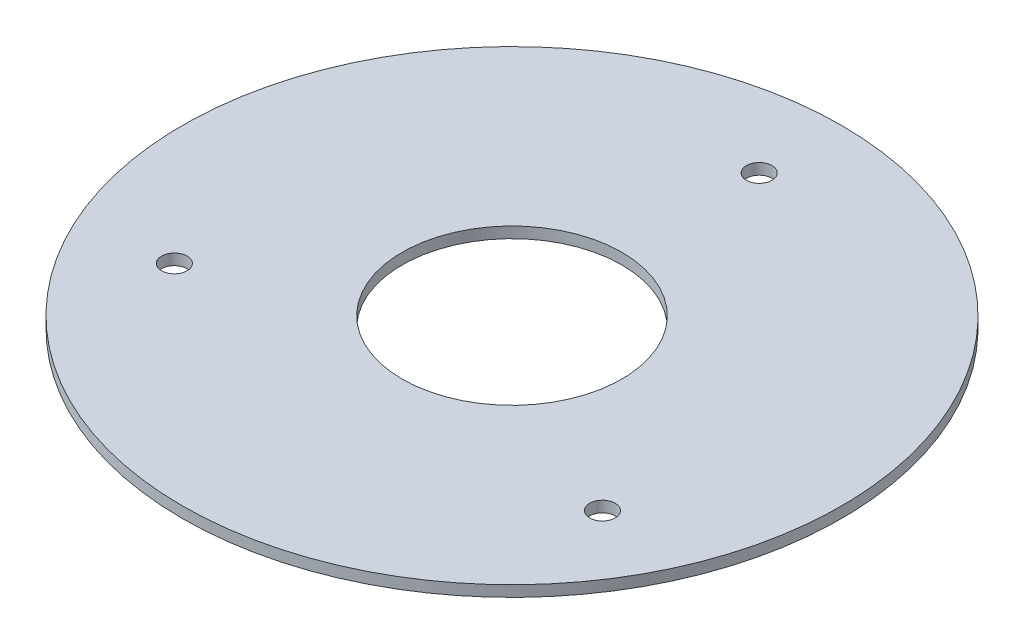
ISO-10303-21;
HEADER;
FILE_DESCRIPTION(('STEP AP214'),'2;1');
FILE_NAME('part.step','',(''),(''),'','','');
FILE_SCHEMA(('AUTOMOTIVE_DESIGN { 1 0 10303 214 1 1 1 1 }'));
ENDSEC;
DATA;
#1=APPLICATION_CONTEXT('core data for automotive mechanical design processes');
#2=APPLICATION_PROTOCOL_DEFINITION('international standard','automotive_design',2000,#1);
#3=PRODUCT_CONTEXT('',#1,'mechanical');
#4=PRODUCT('Part','Part','',(#3));
#5=PRODUCT_RELATED_PRODUCT_CATEGORY('part','',(#4));
#6=PRODUCT_DEFINITION_FORMATION('','',#4);
#7=PRODUCT_DEFINITION_CONTEXT('part definition',#1,'design');
#8=PRODUCT_DEFINITION('design','',#6,#7);
#9=PRODUCT_DEFINITION_SHAPE('','',#8);
#10=(LENGTH_UNIT() NAMED_UNIT(*) SI_UNIT(.MILLI.,.METRE.));
#11=(NAMED_UNIT(*) PLANE_ANGLE_UNIT() SI_UNIT($,.RADIAN.));
#12=(NAMED_UNIT(*) SI_UNIT($,.STERADIAN.) SOLID_ANGLE_UNIT());
#13=UNCERTAINTY_MEASURE_WITH_UNIT(LENGTH_MEASURE(1.E-05),#10,'distance_accuracy_value','');
#14=(GEOMETRIC_REPRESENTATION_CONTEXT(3) GLOBAL_UNCERTAINTY_ASSIGNED_CONTEXT((#13)) GLOBAL_UNIT_ASSIGNED_CONTEXT((#10,
#11,#12)) REPRESENTATION_CONTEXT('',''));
#15=CARTESIAN_POINT('',(0.,0.,0.));
#16=DIRECTION('',(0.,0.,1.));
#17=DIRECTION('',(1.,0.,0.));
#18=AXIS2_PLACEMENT_3D('',#15,#16,#17);
#19=CARTESIAN_POINT('',(0.,2.,0.));
#20=DIRECTION('',(0.,1.,0.));
#21=DIRECTION('',(0.,0.,1.));
#22=AXIS2_PLACEMENT_3D('',#19,#20,#21);
#23=PLANE('',#22);
#24=CARTESIAN_POINT('',(38.9741308020582,2.,22.50172491));
#25=DIRECTION('',(0.,1.,0.));
#26=DIRECTION('',(0.,0.,1.));
#27=AXIS2_PLACEMENT_3D('',#24,#25,#26);
#28=CIRCLE('',#27,2.32306613023066);
#29=CARTESIAN_POINT('',(38.9741308020582,2.,24.8247910402306));
#30=VERTEX_POINT('',#29);
#31=EDGE_CURVE('E54',#30,#30,#28,.T.);
#32=ORIENTED_EDGE('',*,*,#31,.F.);
#33=EDGE_LOOP('',(#32));
#34=FACE_BOUND('',#33,.T.);
#35=CARTESIAN_POINT('',(0.,2.,0.));
#36=DIRECTION('',(0.,1.,0.));
#37=DIRECTION('',(0.,0.,1.));
#38=AXIS2_PLACEMENT_3D('',#35,#36,#37);
#39=CIRCLE('',#38,20.);
#40=CARTESIAN_POINT('',(0.,2.,20.));
#41=VERTEX_POINT('',#40);
#42=EDGE_CURVE('E43',#41,#41,#39,.T.);
#43=ORIENTED_EDGE('',*,*,#42,.F.);
#44=EDGE_LOOP('',(#43));
#45=FACE_BOUND('',#44,.T.);
#46=CARTESIAN_POINT('',(0.,2.,0.));
#47=DIRECTION('',(0.,1.,0.));
#48=DIRECTION('',(0.,0.,1.));
#49=AXIS2_PLACEMENT_3D('',#46,#47,#48);
#50=CIRCLE('',#49,60.);
#51=CARTESIAN_POINT('',(0.,2.,60.));
#52=VERTEX_POINT('',#51);
#53=EDGE_CURVE('E10',#52,#52,#50,.T.);
#54=ORIENTED_EDGE('',*,*,#53,.T.);
#55=EDGE_LOOP('',(#54));
#56=FACE_BOUND('',#55,.T.);
#57=CARTESIAN_POINT('',(0.,2.,-45.00344982));
#58=DIRECTION('',(0.,1.,0.));
#59=DIRECTION('',(0.,0.,1.));
#60=AXIS2_PLACEMENT_3D('',#57,#58,#59);
#61=CIRCLE('',#60,2.32306613023085);
#62=CARTESIAN_POINT('',(0.,2.,-42.6803836897691));
#63=VERTEX_POINT('',#62);
#64=EDGE_CURVE('E48',#63,#63,#61,.T.);
#65=ORIENTED_EDGE('',*,*,#64,.F.);
#66=EDGE_LOOP('',(#65));
#67=FACE_BOUND('',#66,.T.);
#68=CARTESIAN_POINT('',(-38.9741308020582,2.,22.50172491));
#69=DIRECTION('',(0.,1.,0.));
#70=DIRECTION('',(0.,0.,1.));
#71=AXIS2_PLACEMENT_3D('',#68,#69,#70);
#72=CIRCLE('',#71,2.32306613023086);
#73=CARTESIAN_POINT('',(-38.9741308020582,2.,24.8247910402309));
#74=VERTEX_POINT('',#73);
#75=EDGE_CURVE('E60',#74,#74,#72,.T.);
#76=ORIENTED_EDGE('',*,*,#75,.F.);
#77=EDGE_LOOP('',(#76));
#78=FACE_BOUND('',#77,.T.);
#79=ADVANCED_FACE('F32',(#34,#45,#56,#67,#78),#23,.T.);
#80=CARTESIAN_POINT('',(0.,0.,0.));
#81=DIRECTION('',(0.,1.,0.));
#82=DIRECTION('',(0.,0.,1.));
#83=AXIS2_PLACEMENT_3D('',#80,#81,#82);
#84=PLANE('',#83);
#85=CARTESIAN_POINT('',(0.,0.,0.));
#86=DIRECTION('',(0.,1.,0.));
#87=DIRECTION('',(0.,0.,1.));
#88=AXIS2_PLACEMENT_3D('',#85,#86,#87);
#89=CIRCLE('',#88,60.);
#90=CARTESIAN_POINT('',(0.,0.,60.));
#91=VERTEX_POINT('',#90);
#92=EDGE_CURVE('E36',#91,#91,#89,.T.);
#93=ORIENTED_EDGE('',*,*,#92,.F.);
#94=EDGE_LOOP('',(#93));
#95=FACE_BOUND('',#94,.T.);
#96=CARTESIAN_POINT('',(0.,0.,0.));
#97=DIRECTION('',(0.,1.,0.));
#98=DIRECTION('',(0.,0.,1.));
#99=AXIS2_PLACEMENT_3D('',#96,#97,#98);
#100=CIRCLE('',#99,20.);
#101=CARTESIAN_POINT('',(0.,0.,20.));
#102=VERTEX_POINT('',#101);
#103=EDGE_CURVE('E45',#102,#102,#100,.T.);
#104=ORIENTED_EDGE('',*,*,#103,.T.);
#105=EDGE_LOOP('',(#104));
#106=FACE_BOUND('',#105,.T.);
#107=CARTESIAN_POINT('',(0.,0.,-45.00344982));
#108=DIRECTION('',(0.,1.,0.));
#109=DIRECTION('',(0.,0.,1.));
#110=AXIS2_PLACEMENT_3D('',#107,#108,#109);
#111=CIRCLE('',#110,2.32306613023085);
#112=CARTESIAN_POINT('',(0.,0.,-42.6803836897691));
#113=VERTEX_POINT('',#112);
#114=EDGE_CURVE('E51',#113,#113,#111,.T.);
#115=ORIENTED_EDGE('',*,*,#114,.T.);
#116=EDGE_LOOP('',(#115));
#117=FACE_BOUND('',#116,.T.);
#118=CARTESIAN_POINT('',(38.9741308020582,0.,22.50172491));
#119=DIRECTION('',(0.,1.,0.));
#120=DIRECTION('',(0.,0.,1.));
#121=AXIS2_PLACEMENT_3D('',#118,#119,#120);
#122=CIRCLE('',#121,2.32306613023066);
#123=CARTESIAN_POINT('',(38.9741308020582,0.,24.8247910402306));
#124=VERTEX_POINT('',#123);
#125=EDGE_CURVE('E57',#124,#124,#122,.T.);
#126=ORIENTED_EDGE('',*,*,#125,.T.);
#127=EDGE_LOOP('',(#126));
#128=FACE_BOUND('',#127,.T.);
#129=CARTESIAN_POINT('',(-38.9741308020582,0.,22.50172491));
#130=DIRECTION('',(0.,1.,0.));
#131=DIRECTION('',(0.,0.,1.));
#132=AXIS2_PLACEMENT_3D('',#129,#130,#131);
#133=CIRCLE('',#132,2.32306613023086);
#134=CARTESIAN_POINT('',(-38.9741308020582,0.,24.8247910402309));
#135=VERTEX_POINT('',#134);
#136=EDGE_CURVE('E63',#135,#135,#133,.T.);
#137=ORIENTED_EDGE('',*,*,#136,.T.);
#138=EDGE_LOOP('',(#137));
#139=FACE_BOUND('',#138,.T.);
#140=ADVANCED_FACE('F73',(#95,#106,#117,#128,#139),#84,.F.);
#141=CARTESIAN_POINT('',(0.,2.,0.));
#142=DIRECTION('',(0.,-1.,0.));
#143=DIRECTION('',(0.,0.,-1.));
#144=AXIS2_PLACEMENT_3D('',#141,#142,#143);
#145=CYLINDRICAL_SURFACE('',#144,60.);
#146=ORIENTED_EDGE('',*,*,#53,.F.);
#147=EDGE_LOOP('',(#146));
#148=FACE_BOUND('',#147,.T.);
#149=ORIENTED_EDGE('',*,*,#92,.T.);
#150=EDGE_LOOP('',(#149));
#151=FACE_BOUND('',#150,.T.);
#152=ADVANCED_FACE('F34',(#148,#151),#145,.T.);
#153=CARTESIAN_POINT('',(0.,2.,0.));
#154=DIRECTION('',(0.,-1.,0.));
#155=DIRECTION('',(0.,0.,-1.));
#156=AXIS2_PLACEMENT_3D('',#153,#154,#155);
#157=CYLINDRICAL_SURFACE('',#156,20.);
#158=ORIENTED_EDGE('',*,*,#42,.T.);
#159=EDGE_LOOP('',(#158));
#160=FACE_BOUND('',#159,.T.);
#161=ORIENTED_EDGE('',*,*,#103,.F.);
#162=EDGE_LOOP('',(#161));
#163=FACE_BOUND('',#162,.T.);
#164=ADVANCED_FACE('F83',(#160,#163),#157,.F.);
#165=CARTESIAN_POINT('',(0.,2.,-45.00344982));
#166=DIRECTION('',(0.,-1.,0.));
#167=DIRECTION('',(0.,0.,-1.));
#168=AXIS2_PLACEMENT_3D('',#165,#166,#167);
#169=CYLINDRICAL_SURFACE('',#168,2.32306613023085);
#170=ORIENTED_EDGE('',*,*,#64,.T.);
#171=EDGE_LOOP('',(#170));
#172=FACE_BOUND('',#171,.T.);
#173=ORIENTED_EDGE('',*,*,#114,.F.);
#174=EDGE_LOOP('',(#173));
#175=FACE_BOUND('',#174,.T.);
#176=ADVANCED_FACE('F86',(#172,#175),#169,.F.);
#177=CARTESIAN_POINT('',(38.9741308020582,2.,22.50172491));
#178=DIRECTION('',(0.,-1.,0.));
#179=DIRECTION('',(0.,0.,-1.));
#180=AXIS2_PLACEMENT_3D('',#177,#178,#179);
#181=CYLINDRICAL_SURFACE('',#180,2.32306613023066);
#182=ORIENTED_EDGE('',*,*,#31,.T.);
#183=EDGE_LOOP('',(#182));
#184=FACE_BOUND('',#183,.T.);
#185=ORIENTED_EDGE('',*,*,#125,.F.);
#186=EDGE_LOOP('',(#185));
#187=FACE_BOUND('',#186,.T.);
#188=ADVANCED_FACE('F90',(#184,#187),#181,.F.);
#189=CARTESIAN_POINT('',(-38.9741308020582,2.,22.50172491));
#190=DIRECTION('',(0.,-1.,0.));
#191=DIRECTION('',(0.,0.,-1.));
#192=AXIS2_PLACEMENT_3D('',#189,#190,#191);
#193=CYLINDRICAL_SURFACE('',#192,2.32306613023086);
#194=ORIENTED_EDGE('',*,*,#75,.T.);
#195=EDGE_LOOP('',(#194));
#196=FACE_BOUND('',#195,.T.);
#197=ORIENTED_EDGE('',*,*,#136,.F.);
#198=EDGE_LOOP('',(#197));
#199=FACE_BOUND('',#198,.T.);
#200=ADVANCED_FACE('F69',(#196,#199),#193,.F.);
#201=CLOSED_SHELL('',(#79,#140,#152,#164,#176,#188,#200));
#202=MANIFOLD_SOLID_BREP('B2',#201);
#203=ADVANCED_BREP_SHAPE_REPRESENTATION('',(#18,#202),#14);
#204=SHAPE_DEFINITION_REPRESENTATION(#9,#203);
ENDSEC;
END-ISO-10303-21;
